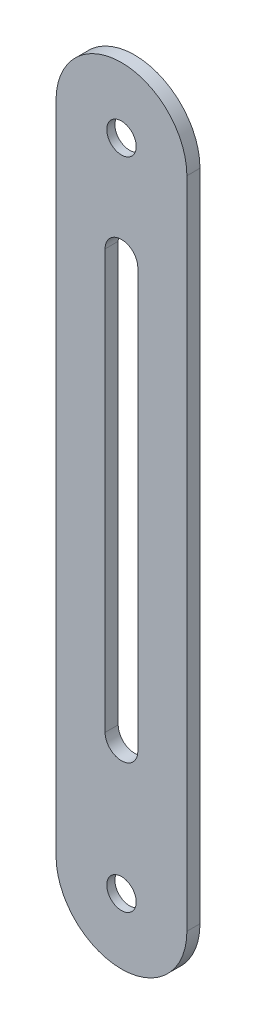
ISO-10303-21;
HEADER;
FILE_DESCRIPTION(('STEP AP214'),'2;1');
FILE_NAME('part.step','',(''),(''),'','','');
FILE_SCHEMA(('AUTOMOTIVE_DESIGN { 1 0 10303 214 1 1 1 1 }'));
ENDSEC;
DATA;
#1=APPLICATION_CONTEXT('core data for automotive mechanical design processes');
#2=APPLICATION_PROTOCOL_DEFINITION('international standard','automotive_design',2000,#1);
#3=PRODUCT_CONTEXT('',#1,'mechanical');
#4=PRODUCT('Part','Part','',(#3));
#5=PRODUCT_RELATED_PRODUCT_CATEGORY('part','',(#4));
#6=PRODUCT_DEFINITION_FORMATION('','',#4);
#7=PRODUCT_DEFINITION_CONTEXT('part definition',#1,'design');
#8=PRODUCT_DEFINITION('design','',#6,#7);
#9=PRODUCT_DEFINITION_SHAPE('','',#8);
#10=(LENGTH_UNIT() NAMED_UNIT(*) SI_UNIT(.MILLI.,.METRE.));
#11=(NAMED_UNIT(*) PLANE_ANGLE_UNIT() SI_UNIT($,.RADIAN.));
#12=(NAMED_UNIT(*) SI_UNIT($,.STERADIAN.) SOLID_ANGLE_UNIT());
#13=UNCERTAINTY_MEASURE_WITH_UNIT(LENGTH_MEASURE(1.E-05),#10,'distance_accuracy_value','');
#14=(GEOMETRIC_REPRESENTATION_CONTEXT(3) GLOBAL_UNCERTAINTY_ASSIGNED_CONTEXT((#13)) GLOBAL_UNIT_ASSIGNED_CONTEXT((#10,
#11,#12)) REPRESENTATION_CONTEXT('',''));
#15=CARTESIAN_POINT('',(0.,0.,0.));
#16=DIRECTION('',(0.,0.,1.));
#17=DIRECTION('',(1.,0.,0.));
#18=AXIS2_PLACEMENT_3D('',#15,#16,#17);
#19=CARTESIAN_POINT('',(0.,-200.,4.));
#20=DIRECTION('',(0.,0.,-1.));
#21=DIRECTION('',(-1.,0.,0.));
#22=AXIS2_PLACEMENT_3D('',#19,#20,#21);
#23=CYLINDRICAL_SURFACE('',#22,8.75);
#24=CARTESIAN_POINT('',(0.,-200.,0.));
#25=DIRECTION('',(0.,0.,1.));
#26=DIRECTION('',(1.,0.,0.));
#27=AXIS2_PLACEMENT_3D('',#24,#25,#26);
#28=CIRCLE('',#27,8.75);
#29=CARTESIAN_POINT('',(8.75000000000003,-200.,0.));
#30=VERTEX_POINT('',#29);
#31=EDGE_CURVE('E153',#30,#30,#28,.T.);
#32=ORIENTED_EDGE('',*,*,#31,.F.);
#33=EDGE_LOOP('',(#32));
#34=FACE_BOUND('',#33,.T.);
#35=CARTESIAN_POINT('',(0.,-200.,1.5));
#36=DIRECTION('',(0.,0.,1.));
#37=DIRECTION('',(1.,0.,0.));
#38=AXIS2_PLACEMENT_3D('',#35,#36,#37);
#39=CIRCLE('',#38,8.75000000000001);
#40=CARTESIAN_POINT('',(8.75000000000003,-200.,1.5));
#41=VERTEX_POINT('',#40);
#42=EDGE_CURVE('E139',#41,#41,#39,.T.);
#43=ORIENTED_EDGE('',*,*,#42,.T.);
#44=EDGE_LOOP('',(#43));
#45=FACE_BOUND('',#44,.T.);
#46=ADVANCED_FACE('F34',(#34,#45),#23,.F.);
#47=CARTESIAN_POINT('',(0.,0.,4.));
#48=DIRECTION('',(0.,0.,-1.));
#49=DIRECTION('',(-1.,0.,0.));
#50=AXIS2_PLACEMENT_3D('',#47,#48,#49);
#51=CYLINDRICAL_SURFACE('',#50,8.75);
#52=CARTESIAN_POINT('',(0.,0.,0.));
#53=DIRECTION('',(0.,0.,1.));
#54=DIRECTION('',(1.,0.,0.));
#55=AXIS2_PLACEMENT_3D('',#52,#53,#54);
#56=CIRCLE('',#55,8.75);
#57=CARTESIAN_POINT('',(8.75,0.,0.));
#58=VERTEX_POINT('',#57);
#59=EDGE_CURVE('E156',#58,#58,#56,.T.);
#60=ORIENTED_EDGE('',*,*,#59,.F.);
#61=EDGE_LOOP('',(#60));
#62=FACE_BOUND('',#61,.T.);
#63=CARTESIAN_POINT('',(0.,0.,1.5));
#64=DIRECTION('',(0.,0.,1.));
#65=DIRECTION('',(1.,0.,0.));
#66=AXIS2_PLACEMENT_3D('',#63,#64,#65);
#67=CIRCLE('',#66,8.75);
#68=CARTESIAN_POINT('',(8.75,0.,1.5));
#69=VERTEX_POINT('',#68);
#70=EDGE_CURVE('E148',#69,#69,#67,.T.);
#71=ORIENTED_EDGE('',*,*,#70,.T.);
#72=EDGE_LOOP('',(#71));
#73=FACE_BOUND('',#72,.T.);
#74=ADVANCED_FACE('F211',(#62,#73),#51,.F.);
#75=CARTESIAN_POINT('',(0.,-200.,4.));
#76=DIRECTION('',(0.,0.,1.));
#77=DIRECTION('',(1.,0.,0.));
#78=AXIS2_PLACEMENT_3D('',#75,#76,#77);
#79=PLANE('',#78);
#80=CARTESIAN_POINT('',(0.,-31.8450046889655,4.));
#81=DIRECTION('',(0.,0.,1.));
#82=DIRECTION('',(-1.,0.,0.));
#83=AXIS2_PLACEMENT_3D('',#80,#81,#82);
#84=CIRCLE('',#83,5.00000000000001);
#85=CARTESIAN_POINT('',(5.00000000000002,-31.8450046889655,4.));
#86=VERTEX_POINT('',#85);
#87=CARTESIAN_POINT('',(-5.,-31.8450046889655,4.));
#88=VERTEX_POINT('',#87);
#89=EDGE_CURVE('E49',#86,#88,#84,.T.);
#90=ORIENTED_EDGE('',*,*,#89,.F.);
#91=DIRECTION('',(0.,1.,0.));
#92=VECTOR('',#91,1.);
#93=CARTESIAN_POINT('',(5.00000000000002,-159.845004688965,4.));
#94=LINE('',#93,#92);
#95=CARTESIAN_POINT('',(5.00000000000002,-159.845004688965,4.));
#96=VERTEX_POINT('',#95);
#97=EDGE_CURVE('E117',#96,#86,#94,.T.);
#98=ORIENTED_EDGE('',*,*,#97,.F.);
#99=CARTESIAN_POINT('',(0.,-159.845004688965,4.));
#100=DIRECTION('',(0.,0.,1.));
#101=DIRECTION('',(1.,0.,0.));
#102=AXIS2_PLACEMENT_3D('',#99,#100,#101);
#103=CIRCLE('',#102,5.);
#104=CARTESIAN_POINT('',(-4.99999999999998,-159.845004688965,4.));
#105=VERTEX_POINT('',#104);
#106=EDGE_CURVE('E120',#105,#96,#103,.T.);
#107=ORIENTED_EDGE('',*,*,#106,.F.);
#108=DIRECTION('',(0.,-1.,0.));
#109=VECTOR('',#108,1.);
#110=CARTESIAN_POINT('',(-5.,-31.8450046889655,4.));
#111=LINE('',#110,#109);
#112=EDGE_CURVE('E126',#88,#105,#111,.T.);
#113=ORIENTED_EDGE('',*,*,#112,.F.);
#114=EDGE_LOOP('',(#90,#98,#107,#113));
#115=FACE_BOUND('',#114,.T.);
#116=CARTESIAN_POINT('',(0.,-200.,4.));
#117=DIRECTION('',(0.,0.,1.));
#118=DIRECTION('',(1.,0.,0.));
#119=AXIS2_PLACEMENT_3D('',#116,#117,#118);
#120=CIRCLE('',#119,20.);
#121=CARTESIAN_POINT('',(-20.,-200.,4.));
#122=VERTEX_POINT('',#121);
#123=CARTESIAN_POINT('',(20.,-200.,4.));
#124=VERTEX_POINT('',#123);
#125=EDGE_CURVE('E160',#122,#124,#120,.T.);
#126=ORIENTED_EDGE('',*,*,#125,.T.);
#127=DIRECTION('',(0.,1.,0.));
#128=VECTOR('',#127,1.);
#129=CARTESIAN_POINT('',(20.,-200.,4.));
#130=LINE('',#129,#128);
#131=CARTESIAN_POINT('',(20.,0.,4.));
#132=VERTEX_POINT('',#131);
#133=EDGE_CURVE('E163',#124,#132,#130,.T.);
#134=ORIENTED_EDGE('',*,*,#133,.T.);
#135=CARTESIAN_POINT('',(0.,0.,4.));
#136=DIRECTION('',(0.,0.,1.));
#137=DIRECTION('',(1.,0.,0.));
#138=AXIS2_PLACEMENT_3D('',#135,#136,#137);
#139=CIRCLE('',#138,20.);
#140=CARTESIAN_POINT('',(-20.,0.,4.));
#141=VERTEX_POINT('',#140);
#142=EDGE_CURVE('E166',#132,#141,#139,.T.);
#143=ORIENTED_EDGE('',*,*,#142,.T.);
#144=DIRECTION('',(0.,-1.,0.));
#145=VECTOR('',#144,1.);
#146=CARTESIAN_POINT('',(-20.,0.,4.));
#147=LINE('',#146,#145);
#148=EDGE_CURVE('E168',#141,#122,#147,.T.);
#149=ORIENTED_EDGE('',*,*,#148,.T.);
#150=EDGE_LOOP('',(#126,#134,#143,#149));
#151=FACE_BOUND('',#150,.T.);
#152=CARTESIAN_POINT('',(0.,0.,4.));
#153=DIRECTION('',(0.,0.,1.));
#154=DIRECTION('',(1.,0.,0.));
#155=AXIS2_PLACEMENT_3D('',#152,#153,#154);
#156=CIRCLE('',#155,4.5);
#157=CARTESIAN_POINT('',(4.5,0.,4.));
#158=VERTEX_POINT('',#157);
#159=EDGE_CURVE('E144',#158,#158,#156,.T.);
#160=ORIENTED_EDGE('',*,*,#159,.F.);
#161=EDGE_LOOP('',(#160));
#162=FACE_BOUND('',#161,.T.);
#163=CARTESIAN_POINT('',(0.,-200.,4.));
#164=DIRECTION('',(0.,0.,1.));
#165=DIRECTION('',(1.,0.,0.));
#166=AXIS2_PLACEMENT_3D('',#163,#164,#165);
#167=CIRCLE('',#166,4.5);
#168=CARTESIAN_POINT('',(4.50000000000002,-200.,4.));
#169=VERTEX_POINT('',#168);
#170=EDGE_CURVE('E132',#169,#169,#167,.T.);
#171=ORIENTED_EDGE('',*,*,#170,.F.);
#172=EDGE_LOOP('',(#171));
#173=FACE_BOUND('',#172,.T.);
#174=ADVANCED_FACE('F201',(#115,#151,#162,#173),#79,.T.);
#175=CARTESIAN_POINT('',(0.,-200.,0.));
#176=DIRECTION('',(0.,0.,1.));
#177=DIRECTION('',(1.,0.,0.));
#178=AXIS2_PLACEMENT_3D('',#175,#176,#177);
#179=PLANE('',#178);
#180=DIRECTION('',(0.,1.,0.));
#181=VECTOR('',#180,1.);
#182=CARTESIAN_POINT('',(5.00000000000002,-159.845004688965,0.));
#183=LINE('',#182,#181);
#184=CARTESIAN_POINT('',(5.00000000000002,-159.845004688965,0.));
#185=VERTEX_POINT('',#184);
#186=CARTESIAN_POINT('',(5.00000000000002,-31.8450046889655,0.));
#187=VERTEX_POINT('',#186);
#188=EDGE_CURVE('E107',#185,#187,#183,.T.);
#189=ORIENTED_EDGE('',*,*,#188,.T.);
#190=CARTESIAN_POINT('',(0.,-31.8450046889655,0.));
#191=DIRECTION('',(0.,0.,1.));
#192=DIRECTION('',(-1.,0.,0.));
#193=AXIS2_PLACEMENT_3D('',#190,#191,#192);
#194=CIRCLE('',#193,5.00000000000001);
#195=CARTESIAN_POINT('',(-5.,-31.8450046889655,0.));
#196=VERTEX_POINT('',#195);
#197=EDGE_CURVE('E101',#187,#196,#194,.T.);
#198=ORIENTED_EDGE('',*,*,#197,.T.);
#199=DIRECTION('',(0.,-1.,0.));
#200=VECTOR('',#199,1.);
#201=CARTESIAN_POINT('',(-5.,-31.8450046889655,0.));
#202=LINE('',#201,#200);
#203=CARTESIAN_POINT('',(-4.99999999999998,-159.845004688965,0.));
#204=VERTEX_POINT('',#203);
#205=EDGE_CURVE('E110',#196,#204,#202,.T.);
#206=ORIENTED_EDGE('',*,*,#205,.T.);
#207=CARTESIAN_POINT('',(0.,-159.845004688965,0.));
#208=DIRECTION('',(0.,0.,1.));
#209=DIRECTION('',(1.,0.,0.));
#210=AXIS2_PLACEMENT_3D('',#207,#208,#209);
#211=CIRCLE('',#210,5.);
#212=EDGE_CURVE('E57',#204,#185,#211,.T.);
#213=ORIENTED_EDGE('',*,*,#212,.T.);
#214=EDGE_LOOP('',(#189,#198,#206,#213));
#215=FACE_BOUND('',#214,.T.);
#216=CARTESIAN_POINT('',(0.,-200.,0.));
#217=DIRECTION('',(0.,0.,1.));
#218=DIRECTION('',(1.,0.,0.));
#219=AXIS2_PLACEMENT_3D('',#216,#217,#218);
#220=CIRCLE('',#219,20.);
#221=CARTESIAN_POINT('',(-20.,-200.,0.));
#222=VERTEX_POINT('',#221);
#223=CARTESIAN_POINT('',(20.,-200.,0.));
#224=VERTEX_POINT('',#223);
#225=EDGE_CURVE('E159',#222,#224,#220,.T.);
#226=ORIENTED_EDGE('',*,*,#225,.F.);
#227=DIRECTION('',(0.,-1.,0.));
#228=VECTOR('',#227,1.);
#229=CARTESIAN_POINT('',(-20.,0.,0.));
#230=LINE('',#229,#228);
#231=CARTESIAN_POINT('',(-20.,0.,0.));
#232=VERTEX_POINT('',#231);
#233=EDGE_CURVE('E164',#232,#222,#230,.T.);
#234=ORIENTED_EDGE('',*,*,#233,.F.);
#235=CARTESIAN_POINT('',(0.,0.,0.));
#236=DIRECTION('',(0.,0.,1.));
#237=DIRECTION('',(1.,0.,0.));
#238=AXIS2_PLACEMENT_3D('',#235,#236,#237);
#239=CIRCLE('',#238,20.);
#240=CARTESIAN_POINT('',(20.,0.,0.));
#241=VERTEX_POINT('',#240);
#242=EDGE_CURVE('E175',#241,#232,#239,.T.);
#243=ORIENTED_EDGE('',*,*,#242,.F.);
#244=DIRECTION('',(0.,1.,0.));
#245=VECTOR('',#244,1.);
#246=CARTESIAN_POINT('',(20.,-200.,0.));
#247=LINE('',#246,#245);
#248=EDGE_CURVE('E173',#224,#241,#247,.T.);
#249=ORIENTED_EDGE('',*,*,#248,.F.);
#250=EDGE_LOOP('',(#226,#234,#243,#249));
#251=FACE_BOUND('',#250,.T.);
#252=ORIENTED_EDGE('',*,*,#59,.T.);
#253=EDGE_LOOP('',(#252));
#254=FACE_BOUND('',#253,.T.);
#255=ORIENTED_EDGE('',*,*,#31,.T.);
#256=EDGE_LOOP('',(#255));
#257=FACE_BOUND('',#256,.T.);
#258=ADVANCED_FACE('F114',(#215,#251,#254,#257),#179,.F.);
#259=CARTESIAN_POINT('',(0.,-200.,4.));
#260=DIRECTION('',(0.,0.,-1.));
#261=DIRECTION('',(-1.,0.,0.));
#262=AXIS2_PLACEMENT_3D('',#259,#260,#261);
#263=CYLINDRICAL_SURFACE('',#262,20.);
#264=ORIENTED_EDGE('',*,*,#225,.T.);
#265=DIRECTION('',(0.,0.,-1.));
#266=VECTOR('',#265,1.);
#267=CARTESIAN_POINT('',(20.,-200.,4.));
#268=LINE('',#267,#266);
#269=EDGE_CURVE('E11',#124,#224,#268,.T.);
#270=ORIENTED_EDGE('',*,*,#269,.F.);
#271=ORIENTED_EDGE('',*,*,#125,.F.);
#272=DIRECTION('',(0.,0.,-1.));
#273=VECTOR('',#272,1.);
#274=CARTESIAN_POINT('',(-20.,-200.,4.));
#275=LINE('',#274,#273);
#276=EDGE_CURVE('E170',#122,#222,#275,.T.);
#277=ORIENTED_EDGE('',*,*,#276,.T.);
#278=EDGE_LOOP('',(#264,#270,#271,#277));
#279=FACE_BOUND('',#278,.T.);
#280=ADVANCED_FACE('F36',(#279),#263,.T.);
#281=CARTESIAN_POINT('',(20.,-200.,4.));
#282=DIRECTION('',(-1.,0.,0.));
#283=DIRECTION('',(0.,-1.,0.));
#284=AXIS2_PLACEMENT_3D('',#281,#282,#283);
#285=PLANE('',#284);
#286=ORIENTED_EDGE('',*,*,#248,.T.);
#287=DIRECTION('',(0.,0.,-1.));
#288=VECTOR('',#287,1.);
#289=CARTESIAN_POINT('',(20.,0.,4.));
#290=LINE('',#289,#288);
#291=EDGE_CURVE('E42',#132,#241,#290,.T.);
#292=ORIENTED_EDGE('',*,*,#291,.F.);
#293=ORIENTED_EDGE('',*,*,#133,.F.);
#294=ORIENTED_EDGE('',*,*,#269,.T.);
#295=EDGE_LOOP('',(#286,#292,#293,#294));
#296=FACE_BOUND('',#295,.T.);
#297=ADVANCED_FACE('F203',(#296),#285,.F.);
#298=CARTESIAN_POINT('',(0.,0.,4.));
#299=DIRECTION('',(0.,0.,-1.));
#300=DIRECTION('',(-1.,0.,0.));
#301=AXIS2_PLACEMENT_3D('',#298,#299,#300);
#302=CYLINDRICAL_SURFACE('',#301,20.);
#303=ORIENTED_EDGE('',*,*,#242,.T.);
#304=DIRECTION('',(0.,0.,-1.));
#305=VECTOR('',#304,1.);
#306=CARTESIAN_POINT('',(-20.,0.,4.));
#307=LINE('',#306,#305);
#308=EDGE_CURVE('E180',#141,#232,#307,.T.);
#309=ORIENTED_EDGE('',*,*,#308,.F.);
#310=ORIENTED_EDGE('',*,*,#142,.F.);
#311=ORIENTED_EDGE('',*,*,#291,.T.);
#312=EDGE_LOOP('',(#303,#309,#310,#311));
#313=FACE_BOUND('',#312,.T.);
#314=ADVANCED_FACE('F187',(#313),#302,.T.);
#315=CARTESIAN_POINT('',(-20.,0.,4.));
#316=DIRECTION('',(1.,0.,0.));
#317=DIRECTION('',(0.,1.,0.));
#318=AXIS2_PLACEMENT_3D('',#315,#316,#317);
#319=PLANE('',#318);
#320=ORIENTED_EDGE('',*,*,#233,.T.);
#321=ORIENTED_EDGE('',*,*,#276,.F.);
#322=ORIENTED_EDGE('',*,*,#148,.F.);
#323=ORIENTED_EDGE('',*,*,#308,.T.);
#324=EDGE_LOOP('',(#320,#321,#322,#323));
#325=FACE_BOUND('',#324,.T.);
#326=ADVANCED_FACE('F195',(#325),#319,.F.);
#327=CARTESIAN_POINT('',(0.,0.,1.5));
#328=DIRECTION('',(0.,0.,1.));
#329=DIRECTION('',(1.,0.,0.));
#330=AXIS2_PLACEMENT_3D('',#327,#328,#329);
#331=PLANE('',#330);
#332=CARTESIAN_POINT('',(0.,0.,1.5));
#333=DIRECTION('',(0.,0.,1.));
#334=DIRECTION('',(1.,0.,0.));
#335=AXIS2_PLACEMENT_3D('',#332,#333,#334);
#336=CIRCLE('',#335,4.5);
#337=CARTESIAN_POINT('',(4.5,0.,1.5));
#338=VERTEX_POINT('',#337);
#339=EDGE_CURVE('E145',#338,#338,#336,.T.);
#340=ORIENTED_EDGE('',*,*,#339,.T.);
#341=EDGE_LOOP('',(#340));
#342=FACE_BOUND('',#341,.T.);
#343=ORIENTED_EDGE('',*,*,#70,.F.);
#344=EDGE_LOOP('',(#343));
#345=FACE_BOUND('',#344,.T.);
#346=ADVANCED_FACE('F222',(#342,#345),#331,.F.);
#347=CARTESIAN_POINT('',(0.,0.,1.5));
#348=DIRECTION('',(0.,0.,1.));
#349=DIRECTION('',(1.,0.,0.));
#350=AXIS2_PLACEMENT_3D('',#347,#348,#349);
#351=CYLINDRICAL_SURFACE('',#350,4.5);
#352=ORIENTED_EDGE('',*,*,#339,.F.);
#353=EDGE_LOOP('',(#352));
#354=FACE_BOUND('',#353,.T.);
#355=ORIENTED_EDGE('',*,*,#159,.T.);
#356=EDGE_LOOP('',(#355));
#357=FACE_BOUND('',#356,.T.);
#358=ADVANCED_FACE('F234',(#354,#357),#351,.F.);
#359=CARTESIAN_POINT('',(0.,-200.,1.5));
#360=DIRECTION('',(0.,0.,1.));
#361=DIRECTION('',(1.,0.,0.));
#362=AXIS2_PLACEMENT_3D('',#359,#360,#361);
#363=PLANE('',#362);
#364=CARTESIAN_POINT('',(0.,-200.,1.5));
#365=DIRECTION('',(0.,0.,1.));
#366=DIRECTION('',(1.,0.,0.));
#367=AXIS2_PLACEMENT_3D('',#364,#365,#366);
#368=CIRCLE('',#367,4.5);
#369=CARTESIAN_POINT('',(4.50000000000002,-200.,1.5));
#370=VERTEX_POINT('',#369);
#371=EDGE_CURVE('E136',#370,#370,#368,.T.);
#372=ORIENTED_EDGE('',*,*,#371,.T.);
#373=EDGE_LOOP('',(#372));
#374=FACE_BOUND('',#373,.T.);
#375=ORIENTED_EDGE('',*,*,#42,.F.);
#376=EDGE_LOOP('',(#375));
#377=FACE_BOUND('',#376,.T.);
#378=ADVANCED_FACE('F239',(#374,#377),#363,.F.);
#379=CARTESIAN_POINT('',(0.,-200.,1.5));
#380=DIRECTION('',(0.,0.,1.));
#381=DIRECTION('',(1.,0.,0.));
#382=AXIS2_PLACEMENT_3D('',#379,#380,#381);
#383=CYLINDRICAL_SURFACE('',#382,4.5);
#384=ORIENTED_EDGE('',*,*,#371,.F.);
#385=EDGE_LOOP('',(#384));
#386=FACE_BOUND('',#385,.T.);
#387=ORIENTED_EDGE('',*,*,#170,.T.);
#388=EDGE_LOOP('',(#387));
#389=FACE_BOUND('',#388,.T.);
#390=ADVANCED_FACE('F250',(#386,#389),#383,.F.);
#391=CARTESIAN_POINT('',(0.,-31.8450046889655,0.));
#392=DIRECTION('',(0.,0.,1.));
#393=DIRECTION('',(1.,0.,0.));
#394=AXIS2_PLACEMENT_3D('',#391,#392,#393);
#395=CYLINDRICAL_SURFACE('',#394,5.00000000000001);
#396=ORIENTED_EDGE('',*,*,#89,.T.);
#397=DIRECTION('',(0.,0.,1.));
#398=VECTOR('',#397,1.);
#399=CARTESIAN_POINT('',(-5.,-31.8450046889655,0.));
#400=LINE('',#399,#398);
#401=EDGE_CURVE('E97',#196,#88,#400,.T.);
#402=ORIENTED_EDGE('',*,*,#401,.F.);
#403=ORIENTED_EDGE('',*,*,#197,.F.);
#404=DIRECTION('',(0.,0.,1.));
#405=VECTOR('',#404,1.);
#406=CARTESIAN_POINT('',(5.00000000000002,-31.8450046889655,0.));
#407=LINE('',#406,#405);
#408=EDGE_CURVE('E130',#187,#86,#407,.T.);
#409=ORIENTED_EDGE('',*,*,#408,.T.);
#410=EDGE_LOOP('',(#396,#402,#403,#409));
#411=FACE_BOUND('',#410,.T.);
#412=ADVANCED_FACE('F99',(#411),#395,.F.);
#413=CARTESIAN_POINT('',(5.00000000000002,-159.845004688965,0.));
#414=DIRECTION('',(1.,0.,0.));
#415=DIRECTION('',(0.,1.,0.));
#416=AXIS2_PLACEMENT_3D('',#413,#414,#415);
#417=PLANE('',#416);
#418=ORIENTED_EDGE('',*,*,#97,.T.);
#419=ORIENTED_EDGE('',*,*,#408,.F.);
#420=ORIENTED_EDGE('',*,*,#188,.F.);
#421=DIRECTION('',(0.,0.,1.));
#422=VECTOR('',#421,1.);
#423=CARTESIAN_POINT('',(5.00000000000002,-159.845004688965,0.));
#424=LINE('',#423,#422);
#425=EDGE_CURVE('E133',#185,#96,#424,.T.);
#426=ORIENTED_EDGE('',*,*,#425,.T.);
#427=EDGE_LOOP('',(#418,#419,#420,#426));
#428=FACE_BOUND('',#427,.T.);
#429=ADVANCED_FACE('F258',(#428),#417,.F.);
#430=CARTESIAN_POINT('',(0.,-159.845004688965,0.));
#431=DIRECTION('',(0.,0.,1.));
#432=DIRECTION('',(1.,0.,0.));
#433=AXIS2_PLACEMENT_3D('',#430,#431,#432);
#434=CYLINDRICAL_SURFACE('',#433,5.);
#435=ORIENTED_EDGE('',*,*,#106,.T.);
#436=ORIENTED_EDGE('',*,*,#425,.F.);
#437=ORIENTED_EDGE('',*,*,#212,.F.);
#438=DIRECTION('',(0.,0.,1.));
#439=VECTOR('',#438,1.);
#440=CARTESIAN_POINT('',(-4.99999999999998,-159.845004688965,0.));
#441=LINE('',#440,#439);
#442=EDGE_CURVE('E106',#204,#105,#441,.T.);
#443=ORIENTED_EDGE('',*,*,#442,.T.);
#444=EDGE_LOOP('',(#435,#436,#437,#443));
#445=FACE_BOUND('',#444,.T.);
#446=ADVANCED_FACE('F266',(#445),#434,.F.);
#447=CARTESIAN_POINT('',(-5.,-31.8450046889655,0.));
#448=DIRECTION('',(-1.,0.,0.));
#449=DIRECTION('',(0.,-1.,0.));
#450=AXIS2_PLACEMENT_3D('',#447,#448,#449);
#451=PLANE('',#450);
#452=ORIENTED_EDGE('',*,*,#112,.T.);
#453=ORIENTED_EDGE('',*,*,#442,.F.);
#454=ORIENTED_EDGE('',*,*,#205,.F.);
#455=ORIENTED_EDGE('',*,*,#401,.T.);
#456=EDGE_LOOP('',(#452,#453,#454,#455));
#457=FACE_BOUND('',#456,.T.);
#458=ADVANCED_FACE('F111',(#457),#451,.F.);
#459=CLOSED_SHELL('',(#46,#74,#174,#258,#280,#297,#314,#326,#346,#358,#378,#390,#412,#429,#446,#458));
#460=MANIFOLD_SOLID_BREP('B2',#459);
#461=ADVANCED_BREP_SHAPE_REPRESENTATION('',(#18,#460),#14);
#462=SHAPE_DEFINITION_REPRESENTATION(#9,#461);
ENDSEC;
END-ISO-10303-21;
